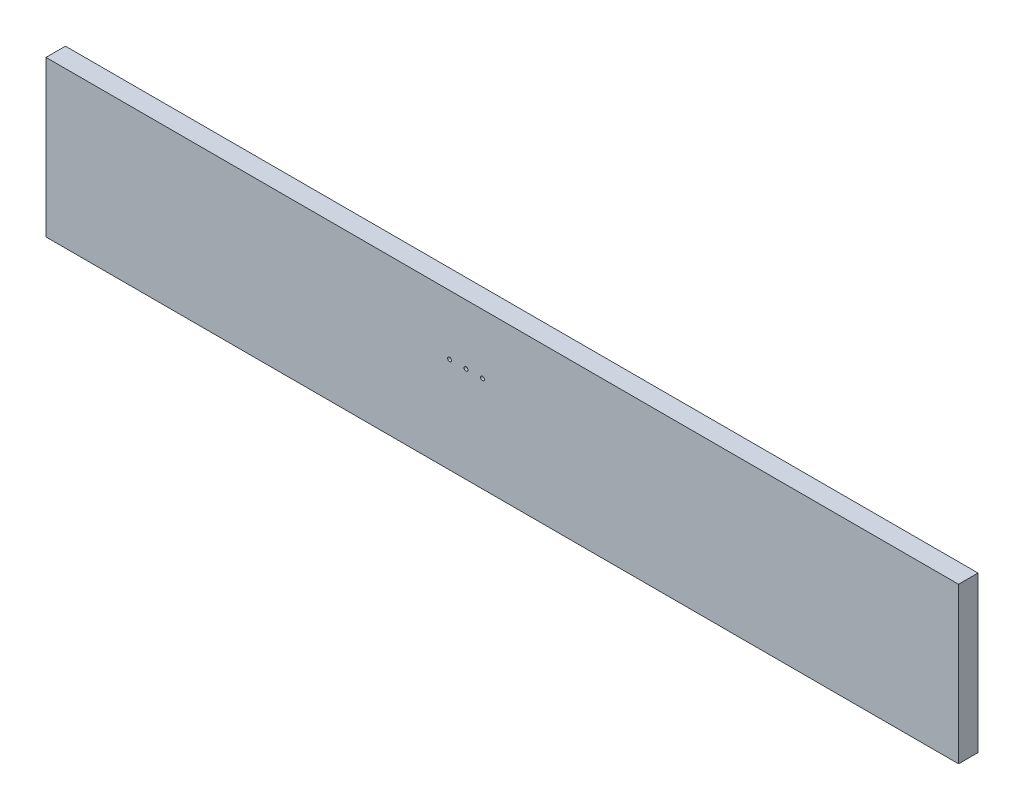
ISO-10303-21;
HEADER;
FILE_DESCRIPTION(('STEP AP214'),'2;1');
FILE_NAME('part.step','',(''),(''),'','','');
FILE_SCHEMA(('AUTOMOTIVE_DESIGN { 1 0 10303 214 1 1 1 1 }'));
ENDSEC;
DATA;
#1=APPLICATION_CONTEXT('core data for automotive mechanical design processes');
#2=APPLICATION_PROTOCOL_DEFINITION('international standard','automotive_design',2000,#1);
#3=PRODUCT_CONTEXT('',#1,'mechanical');
#4=PRODUCT('Part','Part','',(#3));
#5=PRODUCT_RELATED_PRODUCT_CATEGORY('part','',(#4));
#6=PRODUCT_DEFINITION_FORMATION('','',#4);
#7=PRODUCT_DEFINITION_CONTEXT('part definition',#1,'design');
#8=PRODUCT_DEFINITION('design','',#6,#7);
#9=PRODUCT_DEFINITION_SHAPE('','',#8);
#10=(LENGTH_UNIT() NAMED_UNIT(*) SI_UNIT(.MILLI.,.METRE.));
#11=(NAMED_UNIT(*) PLANE_ANGLE_UNIT() SI_UNIT($,.RADIAN.));
#12=(NAMED_UNIT(*) SI_UNIT($,.STERADIAN.) SOLID_ANGLE_UNIT());
#13=UNCERTAINTY_MEASURE_WITH_UNIT(LENGTH_MEASURE(1.E-05),#10,'distance_accuracy_value','');
#14=(GEOMETRIC_REPRESENTATION_CONTEXT(3) GLOBAL_UNCERTAINTY_ASSIGNED_CONTEXT((#13)) GLOBAL_UNIT_ASSIGNED_CONTEXT((#10,
#11,#12)) REPRESENTATION_CONTEXT('',''));
#15=CARTESIAN_POINT('',(0.,0.,0.));
#16=DIRECTION('',(0.,0.,1.));
#17=DIRECTION('',(1.,0.,0.));
#18=AXIS2_PLACEMENT_3D('',#15,#16,#17);
#19=CARTESIAN_POINT('',(352.,60.,15.));
#20=DIRECTION('',(-1.,0.,0.));
#21=DIRECTION('',(0.,0.,1.));
#22=AXIS2_PLACEMENT_3D('',#19,#20,#21);
#23=PLANE('',#22);
#24=DIRECTION('',(0.,1.,0.));
#25=VECTOR('',#24,1.);
#26=CARTESIAN_POINT('',(352.,60.,0.));
#27=LINE('',#26,#25);
#28=CARTESIAN_POINT('',(352.,-60.,0.));
#29=VERTEX_POINT('',#28);
#30=CARTESIAN_POINT('',(352.,60.,0.));
#31=VERTEX_POINT('',#30);
#32=EDGE_CURVE('E113',#29,#31,#27,.T.);
#33=ORIENTED_EDGE('',*,*,#32,.T.);
#34=DIRECTION('',(0.,0.,-1.));
#35=VECTOR('',#34,1.);
#36=CARTESIAN_POINT('',(352.,60.,15.));
#37=LINE('',#36,#35);
#38=CARTESIAN_POINT('',(352.,60.,15.));
#39=VERTEX_POINT('',#38);
#40=EDGE_CURVE('E11',#39,#31,#37,.T.);
#41=ORIENTED_EDGE('',*,*,#40,.F.);
#42=DIRECTION('',(0.,1.,0.));
#43=VECTOR('',#42,1.);
#44=CARTESIAN_POINT('',(352.,60.,15.));
#45=LINE('',#44,#43);
#46=CARTESIAN_POINT('',(352.,-60.,15.));
#47=VERTEX_POINT('',#46);
#48=EDGE_CURVE('E97',#47,#39,#45,.T.);
#49=ORIENTED_EDGE('',*,*,#48,.F.);
#50=DIRECTION('',(0.,0.,-1.));
#51=VECTOR('',#50,1.);
#52=CARTESIAN_POINT('',(352.,-60.,15.));
#53=LINE('',#52,#51);
#54=EDGE_CURVE('E109',#47,#29,#53,.T.);
#55=ORIENTED_EDGE('',*,*,#54,.T.);
#56=EDGE_LOOP('',(#33,#41,#49,#55));
#57=FACE_BOUND('',#56,.T.);
#58=ADVANCED_FACE('F45',(#57),#23,.F.);
#59=CARTESIAN_POINT('',(-352.,60.,15.));
#60=DIRECTION('',(0.,-1.,0.));
#61=DIRECTION('',(0.,0.,-1.));
#62=AXIS2_PLACEMENT_3D('',#59,#60,#61);
#63=PLANE('',#62);
#64=DIRECTION('',(-1.,0.,0.));
#65=VECTOR('',#64,1.);
#66=CARTESIAN_POINT('',(-352.,60.,0.));
#67=LINE('',#66,#65);
#68=CARTESIAN_POINT('',(-352.,60.,0.));
#69=VERTEX_POINT('',#68);
#70=EDGE_CURVE('E102',#31,#69,#67,.T.);
#71=ORIENTED_EDGE('',*,*,#70,.T.);
#72=DIRECTION('',(0.,0.,-1.));
#73=VECTOR('',#72,1.);
#74=CARTESIAN_POINT('',(-352.,60.,15.));
#75=LINE('',#74,#73);
#76=CARTESIAN_POINT('',(-352.,60.,15.));
#77=VERTEX_POINT('',#76);
#78=EDGE_CURVE('E54',#77,#69,#75,.T.);
#79=ORIENTED_EDGE('',*,*,#78,.F.);
#80=DIRECTION('',(-1.,0.,0.));
#81=VECTOR('',#80,1.);
#82=CARTESIAN_POINT('',(-352.,60.,15.));
#83=LINE('',#82,#81);
#84=EDGE_CURVE('E92',#39,#77,#83,.T.);
#85=ORIENTED_EDGE('',*,*,#84,.F.);
#86=ORIENTED_EDGE('',*,*,#40,.T.);
#87=EDGE_LOOP('',(#71,#79,#85,#86));
#88=FACE_BOUND('',#87,.T.);
#89=ADVANCED_FACE('F101',(#88),#63,.F.);
#90=CARTESIAN_POINT('',(-352.,60.,15.));
#91=DIRECTION('',(1.,0.,0.));
#92=DIRECTION('',(0.,0.,-1.));
#93=AXIS2_PLACEMENT_3D('',#90,#91,#92);
#94=PLANE('',#93);
#95=DIRECTION('',(0.,-1.,0.));
#96=VECTOR('',#95,1.);
#97=CARTESIAN_POINT('',(-352.,60.,0.));
#98=LINE('',#97,#96);
#99=CARTESIAN_POINT('',(-352.,-60.,0.));
#100=VERTEX_POINT('',#99);
#101=EDGE_CURVE('E79',#69,#100,#98,.T.);
#102=ORIENTED_EDGE('',*,*,#101,.T.);
#103=DIRECTION('',(0.,0.,-1.));
#104=VECTOR('',#103,1.);
#105=CARTESIAN_POINT('',(-352.,-60.,15.));
#106=LINE('',#105,#104);
#107=CARTESIAN_POINT('',(-352.,-60.,15.));
#108=VERTEX_POINT('',#107);
#109=EDGE_CURVE('E104',#108,#100,#106,.T.);
#110=ORIENTED_EDGE('',*,*,#109,.F.);
#111=DIRECTION('',(0.,-1.,0.));
#112=VECTOR('',#111,1.);
#113=CARTESIAN_POINT('',(-352.,60.,15.));
#114=LINE('',#113,#112);
#115=EDGE_CURVE('E95',#77,#108,#114,.T.);
#116=ORIENTED_EDGE('',*,*,#115,.F.);
#117=ORIENTED_EDGE('',*,*,#78,.T.);
#118=EDGE_LOOP('',(#102,#110,#116,#117));
#119=FACE_BOUND('',#118,.T.);
#120=ADVANCED_FACE('F105',(#119),#94,.F.);
#121=CARTESIAN_POINT('',(-352.,-60.,15.));
#122=DIRECTION('',(0.,1.,0.));
#123=DIRECTION('',(0.,0.,1.));
#124=AXIS2_PLACEMENT_3D('',#121,#122,#123);
#125=PLANE('',#124);
#126=DIRECTION('',(1.,0.,0.));
#127=VECTOR('',#126,1.);
#128=CARTESIAN_POINT('',(-352.,-60.,0.));
#129=LINE('',#128,#127);
#130=EDGE_CURVE('E85',#100,#29,#129,.T.);
#131=ORIENTED_EDGE('',*,*,#130,.T.);
#132=ORIENTED_EDGE('',*,*,#54,.F.);
#133=DIRECTION('',(1.,0.,0.));
#134=VECTOR('',#133,1.);
#135=CARTESIAN_POINT('',(-352.,-60.,15.));
#136=LINE('',#135,#134);
#137=EDGE_CURVE('E62',#108,#47,#136,.T.);
#138=ORIENTED_EDGE('',*,*,#137,.F.);
#139=ORIENTED_EDGE('',*,*,#109,.T.);
#140=EDGE_LOOP('',(#131,#132,#138,#139));
#141=FACE_BOUND('',#140,.T.);
#142=ADVANCED_FACE('F128',(#141),#125,.F.);
#143=CARTESIAN_POINT('',(0.,0.,15.));
#144=DIRECTION('',(0.,0.,1.));
#145=DIRECTION('',(1.,0.,0.));
#146=AXIS2_PLACEMENT_3D('',#143,#144,#145);
#147=PLANE('',#146);
#148=CARTESIAN_POINT('',(-15.2900000000001,13.9,15.));
#149=DIRECTION('',(0.,0.,1.));
#150=DIRECTION('',(1.,0.,0.));
#151=AXIS2_PLACEMENT_3D('',#148,#149,#150);
#152=CIRCLE('',#151,1.5);
#153=CARTESIAN_POINT('',(-13.7900000000001,13.9,15.));
#154=VERTEX_POINT('',#153);
#155=EDGE_CURVE('E151',#154,#154,#152,.T.);
#156=ORIENTED_EDGE('',*,*,#155,.F.);
#157=EDGE_LOOP('',(#156));
#158=FACE_BOUND('',#157,.T.);
#159=CARTESIAN_POINT('',(-27.9900000000001,13.8999999999999,15.));
#160=DIRECTION('',(0.,0.,1.));
#161=DIRECTION('',(1.,0.,0.));
#162=AXIS2_PLACEMENT_3D('',#159,#160,#161);
#163=CIRCLE('',#162,1.5);
#164=CARTESIAN_POINT('',(-26.4900000000001,13.8999999999999,15.));
#165=VERTEX_POINT('',#164);
#166=EDGE_CURVE('E147',#165,#165,#163,.T.);
#167=ORIENTED_EDGE('',*,*,#166,.F.);
#168=EDGE_LOOP('',(#167));
#169=FACE_BOUND('',#168,.T.);
#170=CARTESIAN_POINT('',(-40.6900000000001,13.8999999999998,15.));
#171=DIRECTION('',(0.,0.,1.));
#172=DIRECTION('',(1.,0.,0.));
#173=AXIS2_PLACEMENT_3D('',#170,#171,#172);
#174=CIRCLE('',#173,1.5);
#175=CARTESIAN_POINT('',(-39.1900000000001,13.8999999999998,15.));
#176=VERTEX_POINT('',#175);
#177=EDGE_CURVE('E139',#176,#176,#174,.T.);
#178=ORIENTED_EDGE('',*,*,#177,.F.);
#179=EDGE_LOOP('',(#178));
#180=FACE_BOUND('',#179,.T.);
#181=ORIENTED_EDGE('',*,*,#48,.T.);
#182=ORIENTED_EDGE('',*,*,#84,.T.);
#183=ORIENTED_EDGE('',*,*,#115,.T.);
#184=ORIENTED_EDGE('',*,*,#137,.T.);
#185=EDGE_LOOP('',(#181,#182,#183,#184));
#186=FACE_BOUND('',#185,.T.);
#187=ADVANCED_FACE('F93',(#158,#169,#180,#186),#147,.T.);
#188=CARTESIAN_POINT('',(0.,0.,0.));
#189=DIRECTION('',(0.,0.,1.));
#190=DIRECTION('',(1.,0.,0.));
#191=AXIS2_PLACEMENT_3D('',#188,#189,#190);
#192=PLANE('',#191);
#193=CARTESIAN_POINT('',(-15.2900000000001,13.9,0.));
#194=DIRECTION('',(0.,0.,1.));
#195=DIRECTION('',(1.,0.,0.));
#196=AXIS2_PLACEMENT_3D('',#193,#194,#195);
#197=CIRCLE('',#196,1.5);
#198=CARTESIAN_POINT('',(-13.7900000000001,13.9,0.));
#199=VERTEX_POINT('',#198);
#200=EDGE_CURVE('E117',#199,#199,#197,.T.);
#201=ORIENTED_EDGE('',*,*,#200,.T.);
#202=EDGE_LOOP('',(#201));
#203=FACE_BOUND('',#202,.T.);
#204=CARTESIAN_POINT('',(-27.9900000000001,13.8999999999999,0.));
#205=DIRECTION('',(0.,0.,1.));
#206=DIRECTION('',(1.,0.,0.));
#207=AXIS2_PLACEMENT_3D('',#204,#205,#206);
#208=CIRCLE('',#207,1.5);
#209=CARTESIAN_POINT('',(-26.4900000000001,13.8999999999999,0.));
#210=VERTEX_POINT('',#209);
#211=EDGE_CURVE('E143',#210,#210,#208,.T.);
#212=ORIENTED_EDGE('',*,*,#211,.T.);
#213=EDGE_LOOP('',(#212));
#214=FACE_BOUND('',#213,.T.);
#215=CARTESIAN_POINT('',(-40.6900000000001,13.8999999999998,0.));
#216=DIRECTION('',(0.,0.,1.));
#217=DIRECTION('',(1.,0.,0.));
#218=AXIS2_PLACEMENT_3D('',#215,#216,#217);
#219=CIRCLE('',#218,1.5);
#220=CARTESIAN_POINT('',(-39.1900000000001,13.8999999999998,0.));
#221=VERTEX_POINT('',#220);
#222=EDGE_CURVE('E135',#221,#221,#219,.T.);
#223=ORIENTED_EDGE('',*,*,#222,.T.);
#224=EDGE_LOOP('',(#223));
#225=FACE_BOUND('',#224,.T.);
#226=ORIENTED_EDGE('',*,*,#32,.F.);
#227=ORIENTED_EDGE('',*,*,#130,.F.);
#228=ORIENTED_EDGE('',*,*,#101,.F.);
#229=ORIENTED_EDGE('',*,*,#70,.F.);
#230=EDGE_LOOP('',(#226,#227,#228,#229));
#231=FACE_BOUND('',#230,.T.);
#232=ADVANCED_FACE('F131',(#203,#214,#225,#231),#192,.F.);
#233=CARTESIAN_POINT('',(-40.6900000000001,13.8999999999998,0.));
#234=DIRECTION('',(0.,0.,1.));
#235=DIRECTION('',(1.,0.,0.));
#236=AXIS2_PLACEMENT_3D('',#233,#234,#235);
#237=CYLINDRICAL_SURFACE('',#236,1.5);
#238=ORIENTED_EDGE('',*,*,#222,.F.);
#239=EDGE_LOOP('',(#238));
#240=FACE_BOUND('',#239,.T.);
#241=ORIENTED_EDGE('',*,*,#177,.T.);
#242=EDGE_LOOP('',(#241));
#243=FACE_BOUND('',#242,.T.);
#244=ADVANCED_FACE('F174',(#240,#243),#237,.F.);
#245=CARTESIAN_POINT('',(-27.9900000000001,13.8999999999999,0.));
#246=DIRECTION('',(0.,0.,1.));
#247=DIRECTION('',(1.,0.,0.));
#248=AXIS2_PLACEMENT_3D('',#245,#246,#247);
#249=CYLINDRICAL_SURFACE('',#248,1.5);
#250=ORIENTED_EDGE('',*,*,#211,.F.);
#251=EDGE_LOOP('',(#250));
#252=FACE_BOUND('',#251,.T.);
#253=ORIENTED_EDGE('',*,*,#166,.T.);
#254=EDGE_LOOP('',(#253));
#255=FACE_BOUND('',#254,.T.);
#256=ADVANCED_FACE('F163',(#252,#255),#249,.F.);
#257=CARTESIAN_POINT('',(-15.2900000000001,13.9,0.));
#258=DIRECTION('',(0.,0.,1.));
#259=DIRECTION('',(1.,0.,0.));
#260=AXIS2_PLACEMENT_3D('',#257,#258,#259);
#261=CYLINDRICAL_SURFACE('',#260,1.5);
#262=ORIENTED_EDGE('',*,*,#200,.F.);
#263=EDGE_LOOP('',(#262));
#264=FACE_BOUND('',#263,.T.);
#265=ORIENTED_EDGE('',*,*,#155,.T.);
#266=EDGE_LOOP('',(#265));
#267=FACE_BOUND('',#266,.T.);
#268=ADVANCED_FACE('F160',(#264,#267),#261,.F.);
#269=CLOSED_SHELL('',(#58,#89,#120,#142,#187,#232,#244,#256,#268));
#270=MANIFOLD_SOLID_BREP('B2',#269);
#271=ADVANCED_BREP_SHAPE_REPRESENTATION('',(#18,#270),#14);
#272=SHAPE_DEFINITION_REPRESENTATION(#9,#271);
ENDSEC;
END-ISO-10303-21;
